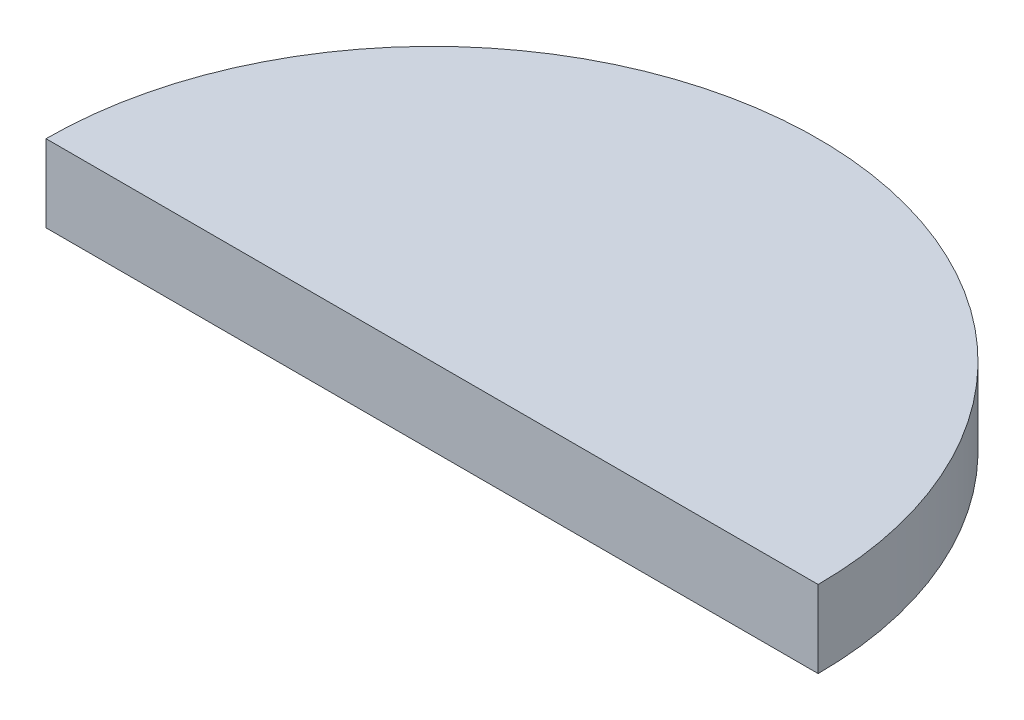
ISO-10303-21;
HEADER;
FILE_DESCRIPTION(('STEP AP214'),'2;1');
FILE_NAME('part.step','',(''),(''),'','','');
FILE_SCHEMA(('AUTOMOTIVE_DESIGN { 1 0 10303 214 1 1 1 1 }'));
ENDSEC;
DATA;
#1=APPLICATION_CONTEXT('core data for automotive mechanical design processes');
#2=APPLICATION_PROTOCOL_DEFINITION('international standard','automotive_design',2000,#1);
#3=PRODUCT_CONTEXT('',#1,'mechanical');
#4=PRODUCT('Part','Part','',(#3));
#5=PRODUCT_RELATED_PRODUCT_CATEGORY('part','',(#4));
#6=PRODUCT_DEFINITION_FORMATION('','',#4);
#7=PRODUCT_DEFINITION_CONTEXT('part definition',#1,'design');
#8=PRODUCT_DEFINITION('design','',#6,#7);
#9=PRODUCT_DEFINITION_SHAPE('','',#8);
#10=(LENGTH_UNIT() NAMED_UNIT(*) SI_UNIT(.MILLI.,.METRE.));
#11=(NAMED_UNIT(*) PLANE_ANGLE_UNIT() SI_UNIT($,.RADIAN.));
#12=(NAMED_UNIT(*) SI_UNIT($,.STERADIAN.) SOLID_ANGLE_UNIT());
#13=UNCERTAINTY_MEASURE_WITH_UNIT(LENGTH_MEASURE(1.E-05),#10,'distance_accuracy_value','');
#14=(GEOMETRIC_REPRESENTATION_CONTEXT(3) GLOBAL_UNCERTAINTY_ASSIGNED_CONTEXT((#13)) GLOBAL_UNIT_ASSIGNED_CONTEXT((#10,
#11,#12)) REPRESENTATION_CONTEXT('',''));
#15=CARTESIAN_POINT('',(0.,0.,0.));
#16=DIRECTION('',(0.,0.,1.));
#17=DIRECTION('',(1.,0.,0.));
#18=AXIS2_PLACEMENT_3D('',#15,#16,#17);
#19=CARTESIAN_POINT('',(10.,2.,0.));
#20=DIRECTION('',(0.,-1.,0.));
#21=DIRECTION('',(0.,0.,-1.));
#22=AXIS2_PLACEMENT_3D('',#19,#20,#21);
#23=CYLINDRICAL_SURFACE('',#22,10.);
#24=CARTESIAN_POINT('',(10.,0.,0.));
#25=DIRECTION('',(0.,1.,0.));
#26=DIRECTION('',(0.,0.,1.));
#27=AXIS2_PLACEMENT_3D('',#24,#25,#26);
#28=CIRCLE('',#27,10.);
#29=CARTESIAN_POINT('',(20.,0.,0.));
#30=VERTEX_POINT('',#29);
#31=CARTESIAN_POINT('',(0.,0.,0.));
#32=VERTEX_POINT('',#31);
#33=EDGE_CURVE('E70',#30,#32,#28,.T.);
#34=ORIENTED_EDGE('',*,*,#33,.T.);
#35=DIRECTION('',(0.,-1.,0.));
#36=VECTOR('',#35,1.);
#37=CARTESIAN_POINT('',(0.,2.,0.));
#38=LINE('',#37,#36);
#39=CARTESIAN_POINT('',(0.,2.,0.));
#40=VERTEX_POINT('',#39);
#41=EDGE_CURVE('E11',#40,#32,#38,.T.);
#42=ORIENTED_EDGE('',*,*,#41,.F.);
#43=CARTESIAN_POINT('',(10.,2.,0.));
#44=DIRECTION('',(0.,1.,0.));
#45=DIRECTION('',(0.,0.,1.));
#46=AXIS2_PLACEMENT_3D('',#43,#44,#45);
#47=CIRCLE('',#46,10.);
#48=CARTESIAN_POINT('',(20.,2.,0.));
#49=VERTEX_POINT('',#48);
#50=EDGE_CURVE('E69',#49,#40,#47,.T.);
#51=ORIENTED_EDGE('',*,*,#50,.F.);
#52=DIRECTION('',(0.,-1.,0.));
#53=VECTOR('',#52,1.);
#54=CARTESIAN_POINT('',(20.,2.,0.));
#55=LINE('',#54,#53);
#56=EDGE_CURVE('E47',#49,#30,#55,.T.);
#57=ORIENTED_EDGE('',*,*,#56,.T.);
#58=EDGE_LOOP('',(#34,#42,#51,#57));
#59=FACE_BOUND('',#58,.T.);
#60=ADVANCED_FACE('F39',(#59),#23,.T.);
#61=CARTESIAN_POINT('',(0.,2.,0.));
#62=DIRECTION('',(0.,0.,-1.));
#63=DIRECTION('',(-1.,0.,0.));
#64=AXIS2_PLACEMENT_3D('',#61,#62,#63);
#65=PLANE('',#64);
#66=DIRECTION('',(1.,0.,0.));
#67=VECTOR('',#66,1.);
#68=CARTESIAN_POINT('',(0.,0.,0.));
#69=LINE('',#68,#67);
#70=EDGE_CURVE('E62',#32,#30,#69,.T.);
#71=ORIENTED_EDGE('',*,*,#70,.T.);
#72=ORIENTED_EDGE('',*,*,#56,.F.);
#73=DIRECTION('',(1.,0.,0.));
#74=VECTOR('',#73,1.);
#75=CARTESIAN_POINT('',(0.,2.,0.));
#76=LINE('',#75,#74);
#77=EDGE_CURVE('E54',#40,#49,#76,.T.);
#78=ORIENTED_EDGE('',*,*,#77,.F.);
#79=ORIENTED_EDGE('',*,*,#41,.T.);
#80=EDGE_LOOP('',(#71,#72,#78,#79));
#81=FACE_BOUND('',#80,.T.);
#82=ADVANCED_FACE('F65',(#81),#65,.F.);
#83=CARTESIAN_POINT('',(10.,2.,0.));
#84=DIRECTION('',(0.,1.,0.));
#85=DIRECTION('',(0.,0.,1.));
#86=AXIS2_PLACEMENT_3D('',#83,#84,#85);
#87=PLANE('',#86);
#88=ORIENTED_EDGE('',*,*,#50,.T.);
#89=ORIENTED_EDGE('',*,*,#77,.T.);
#90=EDGE_LOOP('',(#88,#89));
#91=FACE_BOUND('',#90,.T.);
#92=ADVANCED_FACE('F77',(#91),#87,.T.);
#93=CARTESIAN_POINT('',(10.,0.,0.));
#94=DIRECTION('',(0.,1.,0.));
#95=DIRECTION('',(0.,0.,1.));
#96=AXIS2_PLACEMENT_3D('',#93,#94,#95);
#97=PLANE('',#96);
#98=ORIENTED_EDGE('',*,*,#33,.F.);
#99=ORIENTED_EDGE('',*,*,#70,.F.);
#100=EDGE_LOOP('',(#98,#99));
#101=FACE_BOUND('',#100,.T.);
#102=ADVANCED_FACE('F73',(#101),#97,.F.);
#103=CLOSED_SHELL('',(#60,#82,#92,#102));
#104=MANIFOLD_SOLID_BREP('B2',#103);
#105=ADVANCED_BREP_SHAPE_REPRESENTATION('',(#18,#104),#14);
#106=SHAPE_DEFINITION_REPRESENTATION(#9,#105);
ENDSEC;
END-ISO-10303-21;
